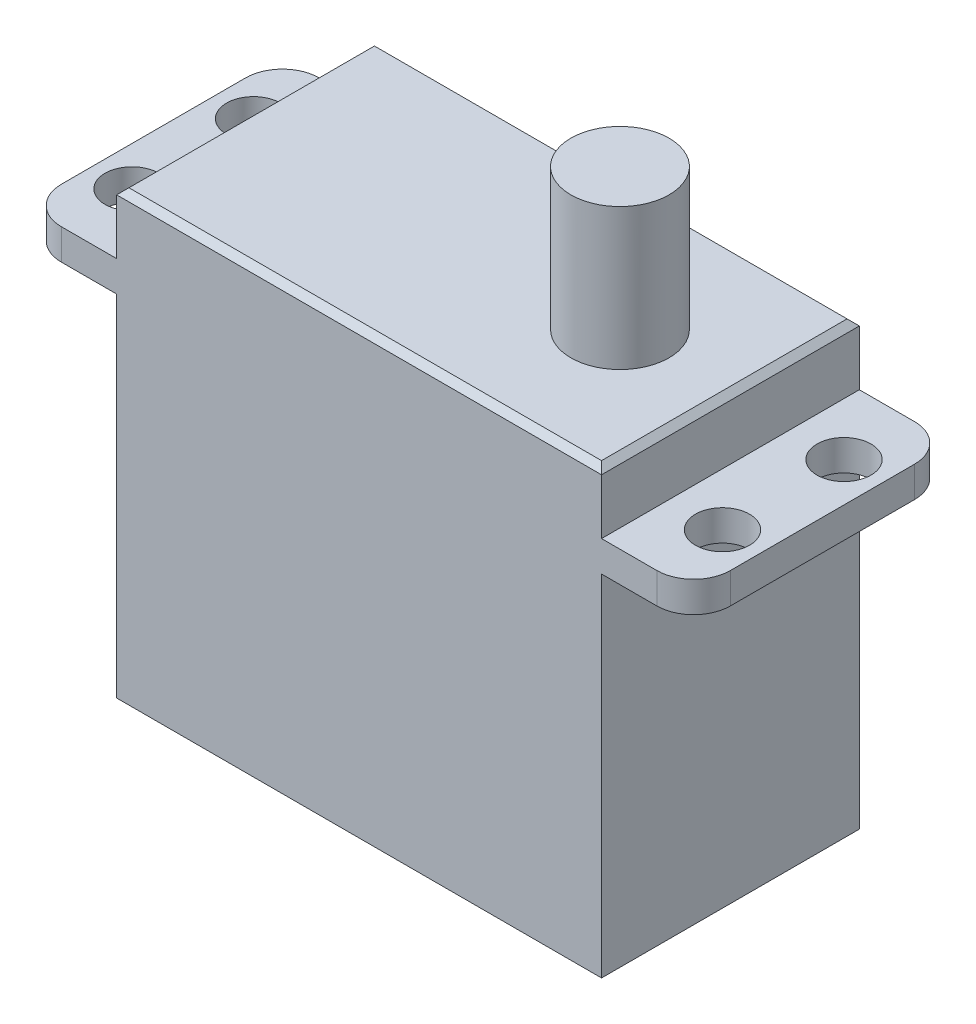
ISO-10303-21;
HEADER;
FILE_DESCRIPTION(('STEP AP214'),'2;1');
FILE_NAME('part.step','',(''),(''),'','','');
FILE_SCHEMA(('AUTOMOTIVE_DESIGN { 1 0 10303 214 1 1 1 1 }'));
ENDSEC;
DATA;
#1=APPLICATION_CONTEXT('core data for automotive mechanical design processes');
#2=APPLICATION_PROTOCOL_DEFINITION('international standard','automotive_design',2000,#1);
#3=PRODUCT_CONTEXT('',#1,'mechanical');
#4=PRODUCT('Part','Part','',(#3));
#5=PRODUCT_RELATED_PRODUCT_CATEGORY('part','',(#4));
#6=PRODUCT_DEFINITION_FORMATION('','',#4);
#7=PRODUCT_DEFINITION_CONTEXT('part definition',#1,'design');
#8=PRODUCT_DEFINITION('design','',#6,#7);
#9=PRODUCT_DEFINITION_SHAPE('','',#8);
#10=(LENGTH_UNIT() NAMED_UNIT(*) SI_UNIT(.MILLI.,.METRE.));
#11=(NAMED_UNIT(*) PLANE_ANGLE_UNIT() SI_UNIT($,.RADIAN.));
#12=(NAMED_UNIT(*) SI_UNIT($,.STERADIAN.) SOLID_ANGLE_UNIT());
#13=UNCERTAINTY_MEASURE_WITH_UNIT(LENGTH_MEASURE(1.E-05),#10,'distance_accuracy_value','');
#14=(GEOMETRIC_REPRESENTATION_CONTEXT(3) GLOBAL_UNCERTAINTY_ASSIGNED_CONTEXT((#13)) GLOBAL_UNIT_ASSIGNED_CONTEXT((#10,
#11,#12)) REPRESENTATION_CONTEXT('',''));
#15=CARTESIAN_POINT('',(0.,0.,0.));
#16=DIRECTION('',(0.,0.,1.));
#17=DIRECTION('',(1.,0.,0.));
#18=AXIS2_PLACEMENT_3D('',#15,#16,#17);
#19=CARTESIAN_POINT('',(-19.75,36.,10.5));
#20=DIRECTION('',(1.,0.,0.));
#21=DIRECTION('',(0.,0.,-1.));
#22=AXIS2_PLACEMENT_3D('',#19,#20,#21);
#23=PLANE('',#22);
#24=DIRECTION('',(0.,-1.,0.));
#25=VECTOR('',#24,1.);
#26=CARTESIAN_POINT('',(-19.75,36.,10.5));
#27=LINE('',#26,#25);
#28=CARTESIAN_POINT('',(-19.75,35.5,10.5));
#29=VERTEX_POINT('',#28);
#30=CARTESIAN_POINT('',(-19.75,31.,10.5));
#31=VERTEX_POINT('',#30);
#32=EDGE_CURVE('E257',#29,#31,#27,.T.);
#33=ORIENTED_EDGE('',*,*,#32,.F.);
#34=DIRECTION('',(0.,0.,-1.));
#35=VECTOR('',#34,1.);
#36=CARTESIAN_POINT('',(-19.75,35.5,10.5));
#37=LINE('',#36,#35);
#38=CARTESIAN_POINT('',(-19.75,35.5,-10.5));
#39=VERTEX_POINT('',#38);
#40=EDGE_CURVE('E173',#29,#39,#37,.T.);
#41=ORIENTED_EDGE('',*,*,#40,.T.);
#42=DIRECTION('',(0.,-1.,0.));
#43=VECTOR('',#42,1.);
#44=CARTESIAN_POINT('',(-19.75,36.,-10.5));
#45=LINE('',#44,#43);
#46=CARTESIAN_POINT('',(-19.75,31.,-10.5));
#47=VERTEX_POINT('',#46);
#48=EDGE_CURVE('E167',#39,#47,#45,.T.);
#49=ORIENTED_EDGE('',*,*,#48,.T.);
#50=DIRECTION('',(0.,0.,1.));
#51=VECTOR('',#50,1.);
#52=CARTESIAN_POINT('',(-19.75,31.,10.5));
#53=LINE('',#52,#51);
#54=EDGE_CURVE('E171',#47,#31,#53,.T.);
#55=ORIENTED_EDGE('',*,*,#54,.T.);
#56=EDGE_LOOP('',(#33,#41,#49,#55));
#57=FACE_BOUND('',#56,.T.);
#58=ADVANCED_FACE('F41',(#57),#23,.F.);
#59=CARTESIAN_POINT('',(19.75,36.,10.5));
#60=DIRECTION('',(-1.,0.,0.));
#61=DIRECTION('',(0.,0.,1.));
#62=AXIS2_PLACEMENT_3D('',#59,#60,#61);
#63=PLANE('',#62);
#64=DIRECTION('',(0.,-1.,0.));
#65=VECTOR('',#64,1.);
#66=CARTESIAN_POINT('',(19.75,36.,-10.5));
#67=LINE('',#66,#65);
#68=CARTESIAN_POINT('',(19.75,35.5,-10.5));
#69=VERTEX_POINT('',#68);
#70=CARTESIAN_POINT('',(19.75,31.,-10.5));
#71=VERTEX_POINT('',#70);
#72=EDGE_CURVE('E259',#69,#71,#67,.T.);
#73=ORIENTED_EDGE('',*,*,#72,.F.);
#74=DIRECTION('',(0.,0.,1.));
#75=VECTOR('',#74,1.);
#76=CARTESIAN_POINT('',(19.75,35.5,10.5));
#77=LINE('',#76,#75);
#78=CARTESIAN_POINT('',(19.75,35.5,10.5));
#79=VERTEX_POINT('',#78);
#80=EDGE_CURVE('E51',#69,#79,#77,.T.);
#81=ORIENTED_EDGE('',*,*,#80,.T.);
#82=DIRECTION('',(0.,-1.,0.));
#83=VECTOR('',#82,1.);
#84=CARTESIAN_POINT('',(19.75,36.,10.5));
#85=LINE('',#84,#83);
#86=CARTESIAN_POINT('',(19.75,31.,10.5));
#87=VERTEX_POINT('',#86);
#88=EDGE_CURVE('E254',#79,#87,#85,.T.);
#89=ORIENTED_EDGE('',*,*,#88,.T.);
#90=DIRECTION('',(0.,0.,1.));
#91=VECTOR('',#90,1.);
#92=CARTESIAN_POINT('',(19.75,31.,10.5));
#93=LINE('',#92,#91);
#94=EDGE_CURVE('E223',#71,#87,#93,.T.);
#95=ORIENTED_EDGE('',*,*,#94,.F.);
#96=EDGE_LOOP('',(#73,#81,#89,#95));
#97=FACE_BOUND('',#96,.T.);
#98=ADVANCED_FACE('F378',(#97),#63,.F.);
#99=DIRECTION('',(0.,0.,-1.));
#100=VECTOR('',#99,1.);
#101=CARTESIAN_POINT('',(19.75,28.5,10.5));
#102=LINE('',#101,#100);
#103=CARTESIAN_POINT('',(19.75,28.5,10.5));
#104=VERTEX_POINT('',#103);
#105=CARTESIAN_POINT('',(19.75,28.5,-10.5));
#106=VERTEX_POINT('',#105);
#107=EDGE_CURVE('E219',#104,#106,#102,.T.);
#108=ORIENTED_EDGE('',*,*,#107,.F.);
#109=CARTESIAN_POINT('',(19.75,0.,10.5));
#110=VERTEX_POINT('',#109);
#111=EDGE_CURVE('E253',#104,#110,#85,.T.);
#112=ORIENTED_EDGE('',*,*,#111,.T.);
#113=DIRECTION('',(0.,0.,-1.));
#114=VECTOR('',#113,1.);
#115=CARTESIAN_POINT('',(19.75,0.,10.5));
#116=LINE('',#115,#114);
#117=CARTESIAN_POINT('',(19.75,0.,-10.5));
#118=VERTEX_POINT('',#117);
#119=EDGE_CURVE('E241',#110,#118,#116,.T.);
#120=ORIENTED_EDGE('',*,*,#119,.T.);
#121=EDGE_CURVE('E174',#106,#118,#67,.T.);
#122=ORIENTED_EDGE('',*,*,#121,.F.);
#123=EDGE_LOOP('',(#108,#112,#120,#122));
#124=FACE_BOUND('',#123,.T.);
#125=ADVANCED_FACE('F385',(#124),#63,.F.);
#126=CARTESIAN_POINT('',(-19.75,36.,-10.5));
#127=DIRECTION('',(0.,0.,1.));
#128=DIRECTION('',(1.,0.,0.));
#129=AXIS2_PLACEMENT_3D('',#126,#127,#128);
#130=PLANE('',#129);
#131=ORIENTED_EDGE('',*,*,#48,.F.);
#132=DIRECTION('',(1.,0.,0.));
#133=VECTOR('',#132,1.);
#134=CARTESIAN_POINT('',(-19.75,35.5,-10.5));
#135=LINE('',#134,#133);
#136=EDGE_CURVE('E11',#39,#69,#135,.T.);
#137=ORIENTED_EDGE('',*,*,#136,.T.);
#138=ORIENTED_EDGE('',*,*,#72,.T.);
#139=DIRECTION('',(-1.,0.,0.));
#140=VECTOR('',#139,1.);
#141=CARTESIAN_POINT('',(27.25,31.,-10.5));
#142=LINE('',#141,#140);
#143=CARTESIAN_POINT('',(24.25,31.,-10.5));
#144=VERTEX_POINT('',#143);
#145=EDGE_CURVE('E222',#144,#71,#142,.T.);
#146=ORIENTED_EDGE('',*,*,#145,.F.);
#147=DIRECTION('',(0.,1.,0.));
#148=VECTOR('',#147,1.);
#149=CARTESIAN_POINT('',(24.25,36.,-10.5));
#150=LINE('',#149,#148);
#151=CARTESIAN_POINT('',(24.25,28.5,-10.5));
#152=VERTEX_POINT('',#151);
#153=EDGE_CURVE('E278',#144,#152,#150,.F.);
#154=ORIENTED_EDGE('',*,*,#153,.T.);
#155=DIRECTION('',(-1.,0.,0.));
#156=VECTOR('',#155,1.);
#157=CARTESIAN_POINT('',(27.25,28.5,-10.5));
#158=LINE('',#157,#156);
#159=EDGE_CURVE('E231',#152,#106,#158,.T.);
#160=ORIENTED_EDGE('',*,*,#159,.T.);
#161=ORIENTED_EDGE('',*,*,#121,.T.);
#162=DIRECTION('',(-1.,0.,0.));
#163=VECTOR('',#162,1.);
#164=CARTESIAN_POINT('',(-19.75,0.,-10.5));
#165=LINE('',#164,#163);
#166=CARTESIAN_POINT('',(-19.75,0.,-10.5));
#167=VERTEX_POINT('',#166);
#168=EDGE_CURVE('E244',#118,#167,#165,.T.);
#169=ORIENTED_EDGE('',*,*,#168,.T.);
#170=CARTESIAN_POINT('',(-19.75,28.5,-10.5));
#171=VERTEX_POINT('',#170);
#172=EDGE_CURVE('E175',#171,#167,#45,.T.);
#173=ORIENTED_EDGE('',*,*,#172,.F.);
#174=DIRECTION('',(1.,0.,0.));
#175=VECTOR('',#174,1.);
#176=CARTESIAN_POINT('',(-27.25,28.5,-10.5));
#177=LINE('',#176,#175);
#178=CARTESIAN_POINT('',(-24.25,28.5,-10.5));
#179=VERTEX_POINT('',#178);
#180=EDGE_CURVE('E186',#179,#171,#177,.T.);
#181=ORIENTED_EDGE('',*,*,#180,.F.);
#182=DIRECTION('',(0.,1.,0.));
#183=VECTOR('',#182,1.);
#184=CARTESIAN_POINT('',(-24.25,36.,-10.5));
#185=LINE('',#184,#183);
#186=CARTESIAN_POINT('',(-24.25,31.,-10.5));
#187=VERTEX_POINT('',#186);
#188=EDGE_CURVE('E183',#179,#187,#185,.T.);
#189=ORIENTED_EDGE('',*,*,#188,.T.);
#190=DIRECTION('',(1.,0.,0.));
#191=VECTOR('',#190,1.);
#192=CARTESIAN_POINT('',(-27.25,31.,-10.5));
#193=LINE('',#192,#191);
#194=EDGE_CURVE('E179',#187,#47,#193,.T.);
#195=ORIENTED_EDGE('',*,*,#194,.T.);
#196=EDGE_LOOP('',(#131,#137,#138,#146,#154,#160,#161,#169,#173,#181,#189,#195));
#197=FACE_BOUND('',#196,.T.);
#198=ADVANCED_FACE('F180',(#197),#130,.F.);
#199=CARTESIAN_POINT('',(-19.75,28.5,10.5));
#200=VERTEX_POINT('',#199);
#201=CARTESIAN_POINT('',(-19.75,0.,10.5));
#202=VERTEX_POINT('',#201);
#203=EDGE_CURVE('E256',#200,#202,#27,.T.);
#204=ORIENTED_EDGE('',*,*,#203,.F.);
#205=DIRECTION('',(0.,0.,-1.));
#206=VECTOR('',#205,1.);
#207=CARTESIAN_POINT('',(-19.75,28.5,10.5));
#208=LINE('',#207,#206);
#209=EDGE_CURVE('E192',#200,#171,#208,.T.);
#210=ORIENTED_EDGE('',*,*,#209,.T.);
#211=ORIENTED_EDGE('',*,*,#172,.T.);
#212=DIRECTION('',(0.,0.,1.));
#213=VECTOR('',#212,1.);
#214=CARTESIAN_POINT('',(-19.75,0.,10.5));
#215=LINE('',#214,#213);
#216=EDGE_CURVE('E247',#167,#202,#215,.T.);
#217=ORIENTED_EDGE('',*,*,#216,.T.);
#218=EDGE_LOOP('',(#204,#210,#211,#217));
#219=FACE_BOUND('',#218,.T.);
#220=ADVANCED_FACE('F380',(#219),#23,.F.);
#221=CARTESIAN_POINT('',(-19.75,36.,10.5));
#222=DIRECTION('',(0.,0.,-1.));
#223=DIRECTION('',(-1.,0.,0.));
#224=AXIS2_PLACEMENT_3D('',#221,#222,#223);
#225=PLANE('',#224);
#226=ORIENTED_EDGE('',*,*,#88,.F.);
#227=DIRECTION('',(-1.,0.,0.));
#228=VECTOR('',#227,1.);
#229=CARTESIAN_POINT('',(-19.75,35.5,10.5));
#230=LINE('',#229,#228);
#231=EDGE_CURVE('E315',#79,#29,#230,.T.);
#232=ORIENTED_EDGE('',*,*,#231,.T.);
#233=ORIENTED_EDGE('',*,*,#32,.T.);
#234=DIRECTION('',(1.,0.,0.));
#235=VECTOR('',#234,1.);
#236=CARTESIAN_POINT('',(-27.25,31.,10.5));
#237=LINE('',#236,#235);
#238=CARTESIAN_POINT('',(-24.25,31.,10.5));
#239=VERTEX_POINT('',#238);
#240=EDGE_CURVE('E191',#239,#31,#237,.T.);
#241=ORIENTED_EDGE('',*,*,#240,.F.);
#242=DIRECTION('',(0.,-1.,0.));
#243=VECTOR('',#242,1.);
#244=CARTESIAN_POINT('',(-24.25,36.,10.5));
#245=LINE('',#244,#243);
#246=CARTESIAN_POINT('',(-24.25,28.5,10.5));
#247=VERTEX_POINT('',#246);
#248=EDGE_CURVE('E302',#239,#247,#245,.T.);
#249=ORIENTED_EDGE('',*,*,#248,.T.);
#250=DIRECTION('',(1.,0.,0.));
#251=VECTOR('',#250,1.);
#252=CARTESIAN_POINT('',(-27.25,28.5,10.5));
#253=LINE('',#252,#251);
#254=EDGE_CURVE('E206',#247,#200,#253,.T.);
#255=ORIENTED_EDGE('',*,*,#254,.T.);
#256=ORIENTED_EDGE('',*,*,#203,.T.);
#257=DIRECTION('',(1.,0.,0.));
#258=VECTOR('',#257,1.);
#259=CARTESIAN_POINT('',(-19.75,0.,10.5));
#260=LINE('',#259,#258);
#261=EDGE_CURVE('E250',#202,#110,#260,.T.);
#262=ORIENTED_EDGE('',*,*,#261,.T.);
#263=ORIENTED_EDGE('',*,*,#111,.F.);
#264=DIRECTION('',(-1.,0.,0.));
#265=VECTOR('',#264,1.);
#266=CARTESIAN_POINT('',(27.25,28.5,10.5));
#267=LINE('',#266,#265);
#268=CARTESIAN_POINT('',(24.25,28.5,10.5));
#269=VERTEX_POINT('',#268);
#270=EDGE_CURVE('E233',#269,#104,#267,.T.);
#271=ORIENTED_EDGE('',*,*,#270,.F.);
#272=DIRECTION('',(0.,-1.,0.));
#273=VECTOR('',#272,1.);
#274=CARTESIAN_POINT('',(24.25,36.,10.5));
#275=LINE('',#274,#273);
#276=CARTESIAN_POINT('',(24.25,31.,10.5));
#277=VERTEX_POINT('',#276);
#278=EDGE_CURVE('E284',#269,#277,#275,.F.);
#279=ORIENTED_EDGE('',*,*,#278,.T.);
#280=DIRECTION('',(-1.,0.,0.));
#281=VECTOR('',#280,1.);
#282=CARTESIAN_POINT('',(27.25,31.,10.5));
#283=LINE('',#282,#281);
#284=EDGE_CURVE('E235',#277,#87,#283,.T.);
#285=ORIENTED_EDGE('',*,*,#284,.T.);
#286=EDGE_LOOP('',(#226,#232,#233,#241,#249,#255,#256,#262,#263,#271,#279,#285));
#287=FACE_BOUND('',#286,.T.);
#288=ADVANCED_FACE('F357',(#287),#225,.F.);
#289=CARTESIAN_POINT('',(0.,36.,0.));
#290=DIRECTION('',(0.,-1.,0.));
#291=DIRECTION('',(0.,0.,-1.));
#292=AXIS2_PLACEMENT_3D('',#289,#290,#291);
#293=PLANE('',#292);
#294=DIRECTION('',(-1.,0.,0.));
#295=VECTOR('',#294,1.);
#296=CARTESIAN_POINT('',(0.,36.,-10.));
#297=LINE('',#296,#295);
#298=CARTESIAN_POINT('',(19.25,36.,-10.));
#299=VERTEX_POINT('',#298);
#300=CARTESIAN_POINT('',(-19.25,36.,-10.));
#301=VERTEX_POINT('',#300);
#302=EDGE_CURVE('E305',#299,#301,#297,.T.);
#303=ORIENTED_EDGE('',*,*,#302,.T.);
#304=DIRECTION('',(0.,0.,1.));
#305=VECTOR('',#304,1.);
#306=CARTESIAN_POINT('',(-19.25,36.,0.));
#307=LINE('',#306,#305);
#308=CARTESIAN_POINT('',(-19.25,36.,10.));
#309=VERTEX_POINT('',#308);
#310=EDGE_CURVE('E311',#301,#309,#307,.T.);
#311=ORIENTED_EDGE('',*,*,#310,.T.);
#312=DIRECTION('',(1.,0.,0.));
#313=VECTOR('',#312,1.);
#314=CARTESIAN_POINT('',(0.,36.,10.));
#315=LINE('',#314,#313);
#316=CARTESIAN_POINT('',(19.25,36.,10.));
#317=VERTEX_POINT('',#316);
#318=EDGE_CURVE('E309',#309,#317,#315,.T.);
#319=ORIENTED_EDGE('',*,*,#318,.T.);
#320=DIRECTION('',(0.,0.,-1.));
#321=VECTOR('',#320,1.);
#322=CARTESIAN_POINT('',(19.25,36.,0.));
#323=LINE('',#322,#321);
#324=EDGE_CURVE('E307',#317,#299,#323,.T.);
#325=ORIENTED_EDGE('',*,*,#324,.T.);
#326=EDGE_LOOP('',(#303,#311,#319,#325));
#327=FACE_BOUND('',#326,.T.);
#328=CARTESIAN_POINT('',(10.75,36.,0.));
#329=DIRECTION('',(0.,-1.,0.));
#330=DIRECTION('',(0.,0.,-1.));
#331=AXIS2_PLACEMENT_3D('',#328,#329,#330);
#332=CIRCLE('',#331,4.);
#333=CARTESIAN_POINT('',(10.75,36.,-4.));
#334=VERTEX_POINT('',#333);
#335=EDGE_CURVE('E261',#334,#334,#332,.F.);
#336=ORIENTED_EDGE('',*,*,#335,.F.);
#337=EDGE_LOOP('',(#336));
#338=FACE_BOUND('',#337,.T.);
#339=ADVANCED_FACE('F366',(#327,#338),#293,.F.);
#340=CARTESIAN_POINT('',(0.,0.,0.));
#341=DIRECTION('',(0.,-1.,0.));
#342=DIRECTION('',(0.,0.,-1.));
#343=AXIS2_PLACEMENT_3D('',#340,#341,#342);
#344=PLANE('',#343);
#345=ORIENTED_EDGE('',*,*,#119,.F.);
#346=ORIENTED_EDGE('',*,*,#261,.F.);
#347=ORIENTED_EDGE('',*,*,#216,.F.);
#348=ORIENTED_EDGE('',*,*,#168,.F.);
#349=EDGE_LOOP('',(#345,#346,#347,#348));
#350=FACE_BOUND('',#349,.T.);
#351=ADVANCED_FACE('F407',(#350),#344,.T.);
#352=CARTESIAN_POINT('',(10.75,47.5,0.));
#353=DIRECTION('',(0.,-1.,0.));
#354=DIRECTION('',(0.,0.,-1.));
#355=AXIS2_PLACEMENT_3D('',#352,#353,#354);
#356=CYLINDRICAL_SURFACE('',#355,4.);
#357=CARTESIAN_POINT('',(10.75,47.5,0.));
#358=DIRECTION('',(0.,1.,0.));
#359=DIRECTION('',(0.,0.,1.));
#360=AXIS2_PLACEMENT_3D('',#357,#358,#359);
#361=CIRCLE('',#360,4.);
#362=CARTESIAN_POINT('',(10.75,47.5,4.));
#363=VERTEX_POINT('',#362);
#364=EDGE_CURVE('E238',#363,#363,#361,.T.);
#365=ORIENTED_EDGE('',*,*,#364,.F.);
#366=EDGE_LOOP('',(#365));
#367=FACE_BOUND('',#366,.T.);
#368=ORIENTED_EDGE('',*,*,#335,.T.);
#369=EDGE_LOOP('',(#368));
#370=FACE_BOUND('',#369,.T.);
#371=ADVANCED_FACE('F450',(#367,#370),#356,.T.);
#372=CARTESIAN_POINT('',(10.75,47.5,0.));
#373=DIRECTION('',(0.,1.,0.));
#374=DIRECTION('',(0.,0.,1.));
#375=AXIS2_PLACEMENT_3D('',#372,#373,#374);
#376=PLANE('',#375);
#377=ORIENTED_EDGE('',*,*,#364,.T.);
#378=EDGE_LOOP('',(#377));
#379=FACE_BOUND('',#378,.T.);
#380=ADVANCED_FACE('F442',(#379),#376,.T.);
#381=CARTESIAN_POINT('',(27.25,31.,10.5));
#382=DIRECTION('',(0.,-1.,0.));
#383=DIRECTION('',(0.,0.,-1.));
#384=AXIS2_PLACEMENT_3D('',#381,#382,#383);
#385=PLANE('',#384);
#386=CARTESIAN_POINT('',(24.05,31.,-4.94999999999999));
#387=DIRECTION('',(0.,1.,0.));
#388=DIRECTION('',(0.,0.,1.));
#389=AXIS2_PLACEMENT_3D('',#386,#387,#388);
#390=CIRCLE('',#389,2.20000000000001);
#391=CARTESIAN_POINT('',(24.05,31.,-2.74999999999998));
#392=VERTEX_POINT('',#391);
#393=EDGE_CURVE('E209',#392,#392,#390,.T.);
#394=ORIENTED_EDGE('',*,*,#393,.F.);
#395=EDGE_LOOP('',(#394));
#396=FACE_BOUND('',#395,.T.);
#397=CARTESIAN_POINT('',(24.05,31.,4.95000000000001));
#398=DIRECTION('',(0.,1.,0.));
#399=DIRECTION('',(0.,0.,1.));
#400=AXIS2_PLACEMENT_3D('',#397,#398,#399);
#401=CIRCLE('',#400,2.20000000000003);
#402=CARTESIAN_POINT('',(24.05,31.,7.15000000000004));
#403=VERTEX_POINT('',#402);
#404=EDGE_CURVE('E185',#403,#403,#401,.T.);
#405=ORIENTED_EDGE('',*,*,#404,.F.);
#406=EDGE_LOOP('',(#405));
#407=FACE_BOUND('',#406,.T.);
#408=DIRECTION('',(0.,0.,1.));
#409=VECTOR('',#408,1.);
#410=CARTESIAN_POINT('',(27.25,31.,10.5));
#411=LINE('',#410,#409);
#412=CARTESIAN_POINT('',(27.25,31.,-7.5));
#413=VERTEX_POINT('',#412);
#414=CARTESIAN_POINT('',(27.25,31.,7.5));
#415=VERTEX_POINT('',#414);
#416=EDGE_CURVE('E215',#413,#415,#411,.T.);
#417=ORIENTED_EDGE('',*,*,#416,.F.);
#418=CARTESIAN_POINT('',(24.25,31.,-7.5));
#419=DIRECTION('',(0.,-1.,0.));
#420=DIRECTION('',(0.,0.,-1.));
#421=AXIS2_PLACEMENT_3D('',#418,#419,#420);
#422=CIRCLE('',#421,3.);
#423=EDGE_CURVE('E276',#413,#144,#422,.F.);
#424=ORIENTED_EDGE('',*,*,#423,.T.);
#425=ORIENTED_EDGE('',*,*,#145,.T.);
#426=ORIENTED_EDGE('',*,*,#94,.T.);
#427=ORIENTED_EDGE('',*,*,#284,.F.);
#428=CARTESIAN_POINT('',(24.25,31.,7.5));
#429=DIRECTION('',(0.,-1.,0.));
#430=DIRECTION('',(0.,0.,-1.));
#431=AXIS2_PLACEMENT_3D('',#428,#429,#430);
#432=CIRCLE('',#431,3.);
#433=EDGE_CURVE('E274',#277,#415,#432,.F.);
#434=ORIENTED_EDGE('',*,*,#433,.T.);
#435=EDGE_LOOP('',(#417,#424,#425,#426,#427,#434));
#436=FACE_BOUND('',#435,.T.);
#437=ADVANCED_FACE('F420',(#396,#407,#436),#385,.F.);
#438=CARTESIAN_POINT('',(27.25,28.5,10.5));
#439=DIRECTION('',(0.,1.,0.));
#440=DIRECTION('',(0.,0.,1.));
#441=AXIS2_PLACEMENT_3D('',#438,#439,#440);
#442=PLANE('',#441);
#443=CARTESIAN_POINT('',(24.05,28.5,-4.94999999999999));
#444=DIRECTION('',(0.,1.,0.));
#445=DIRECTION('',(0.,0.,1.));
#446=AXIS2_PLACEMENT_3D('',#443,#444,#445);
#447=CIRCLE('',#446,2.20000000000001);
#448=CARTESIAN_POINT('',(24.05,28.5,-2.74999999999998));
#449=VERTEX_POINT('',#448);
#450=EDGE_CURVE('E226',#449,#449,#447,.T.);
#451=ORIENTED_EDGE('',*,*,#450,.T.);
#452=EDGE_LOOP('',(#451));
#453=FACE_BOUND('',#452,.T.);
#454=CARTESIAN_POINT('',(24.05,28.5,4.95000000000001));
#455=DIRECTION('',(0.,1.,0.));
#456=DIRECTION('',(0.,0.,1.));
#457=AXIS2_PLACEMENT_3D('',#454,#455,#456);
#458=CIRCLE('',#457,2.20000000000003);
#459=CARTESIAN_POINT('',(24.05,28.5,7.15000000000004));
#460=VERTEX_POINT('',#459);
#461=EDGE_CURVE('E212',#460,#460,#458,.T.);
#462=ORIENTED_EDGE('',*,*,#461,.T.);
#463=EDGE_LOOP('',(#462));
#464=FACE_BOUND('',#463,.T.);
#465=ORIENTED_EDGE('',*,*,#159,.F.);
#466=CARTESIAN_POINT('',(24.25,28.5,-7.5));
#467=DIRECTION('',(0.,1.,0.));
#468=DIRECTION('',(0.,0.,1.));
#469=AXIS2_PLACEMENT_3D('',#466,#467,#468);
#470=CIRCLE('',#469,3.);
#471=CARTESIAN_POINT('',(27.25,28.5,-7.5));
#472=VERTEX_POINT('',#471);
#473=EDGE_CURVE('E282',#152,#472,#470,.F.);
#474=ORIENTED_EDGE('',*,*,#473,.T.);
#475=DIRECTION('',(0.,0.,-1.));
#476=VECTOR('',#475,1.);
#477=CARTESIAN_POINT('',(27.25,28.5,10.5));
#478=LINE('',#477,#476);
#479=CARTESIAN_POINT('',(27.25,28.5,7.5));
#480=VERTEX_POINT('',#479);
#481=EDGE_CURVE('E218',#480,#472,#478,.T.);
#482=ORIENTED_EDGE('',*,*,#481,.F.);
#483=CARTESIAN_POINT('',(24.25,28.5,7.5));
#484=DIRECTION('',(0.,1.,0.));
#485=DIRECTION('',(0.,0.,1.));
#486=AXIS2_PLACEMENT_3D('',#483,#484,#485);
#487=CIRCLE('',#486,3.);
#488=EDGE_CURVE('E280',#480,#269,#487,.F.);
#489=ORIENTED_EDGE('',*,*,#488,.T.);
#490=ORIENTED_EDGE('',*,*,#270,.T.);
#491=ORIENTED_EDGE('',*,*,#107,.T.);
#492=EDGE_LOOP('',(#465,#474,#482,#489,#490,#491));
#493=FACE_BOUND('',#492,.T.);
#494=ADVANCED_FACE('F432',(#453,#464,#493),#442,.F.);
#495=CARTESIAN_POINT('',(27.25,0.,0.));
#496=DIRECTION('',(-1.,0.,0.));
#497=DIRECTION('',(0.,0.,1.));
#498=AXIS2_PLACEMENT_3D('',#495,#496,#497);
#499=PLANE('',#498);
#500=ORIENTED_EDGE('',*,*,#481,.T.);
#501=DIRECTION('',(0.,1.,0.));
#502=VECTOR('',#501,1.);
#503=CARTESIAN_POINT('',(27.25,0.,-7.5));
#504=LINE('',#503,#502);
#505=EDGE_CURVE('E271',#472,#413,#504,.T.);
#506=ORIENTED_EDGE('',*,*,#505,.T.);
#507=ORIENTED_EDGE('',*,*,#416,.T.);
#508=DIRECTION('',(0.,-1.,0.));
#509=VECTOR('',#508,1.);
#510=CARTESIAN_POINT('',(27.25,0.,7.5));
#511=LINE('',#510,#509);
#512=EDGE_CURVE('E264',#415,#480,#511,.T.);
#513=ORIENTED_EDGE('',*,*,#512,.T.);
#514=EDGE_LOOP('',(#500,#506,#507,#513));
#515=FACE_BOUND('',#514,.T.);
#516=ADVANCED_FACE('F422',(#515),#499,.F.);
#517=CARTESIAN_POINT('',(24.05,23.5,4.95000000000001));
#518=DIRECTION('',(0.,1.,0.));
#519=DIRECTION('',(0.,0.,1.));
#520=AXIS2_PLACEMENT_3D('',#517,#518,#519);
#521=CYLINDRICAL_SURFACE('',#520,2.20000000000003);
#522=ORIENTED_EDGE('',*,*,#404,.T.);
#523=EDGE_LOOP('',(#522));
#524=FACE_BOUND('',#523,.T.);
#525=ORIENTED_EDGE('',*,*,#461,.F.);
#526=EDGE_LOOP('',(#525));
#527=FACE_BOUND('',#526,.T.);
#528=ADVANCED_FACE('F440',(#524,#527),#521,.F.);
#529=CARTESIAN_POINT('',(24.05,23.5,-4.94999999999999));
#530=DIRECTION('',(0.,1.,0.));
#531=DIRECTION('',(0.,0.,1.));
#532=AXIS2_PLACEMENT_3D('',#529,#530,#531);
#533=CYLINDRICAL_SURFACE('',#532,2.20000000000001);
#534=ORIENTED_EDGE('',*,*,#393,.T.);
#535=EDGE_LOOP('',(#534));
#536=FACE_BOUND('',#535,.T.);
#537=ORIENTED_EDGE('',*,*,#450,.F.);
#538=EDGE_LOOP('',(#537));
#539=FACE_BOUND('',#538,.T.);
#540=ADVANCED_FACE('F484',(#536,#539),#533,.F.);
#541=CARTESIAN_POINT('',(24.25,0.,-7.5));
#542=DIRECTION('',(0.,1.,0.));
#543=DIRECTION('',(0.,0.,1.));
#544=AXIS2_PLACEMENT_3D('',#541,#542,#543);
#545=CYLINDRICAL_SURFACE('',#544,3.);
#546=ORIENTED_EDGE('',*,*,#473,.F.);
#547=ORIENTED_EDGE('',*,*,#153,.F.);
#548=ORIENTED_EDGE('',*,*,#423,.F.);
#549=ORIENTED_EDGE('',*,*,#505,.F.);
#550=EDGE_LOOP('',(#546,#547,#548,#549));
#551=FACE_BOUND('',#550,.T.);
#552=ADVANCED_FACE('F427',(#551),#545,.T.);
#553=CARTESIAN_POINT('',(24.25,0.,7.5));
#554=DIRECTION('',(0.,-1.,0.));
#555=DIRECTION('',(0.,0.,-1.));
#556=AXIS2_PLACEMENT_3D('',#553,#554,#555);
#557=CYLINDRICAL_SURFACE('',#556,3.);
#558=ORIENTED_EDGE('',*,*,#433,.F.);
#559=ORIENTED_EDGE('',*,*,#278,.F.);
#560=ORIENTED_EDGE('',*,*,#488,.F.);
#561=ORIENTED_EDGE('',*,*,#512,.F.);
#562=EDGE_LOOP('',(#558,#559,#560,#561));
#563=FACE_BOUND('',#562,.T.);
#564=ADVANCED_FACE('F416',(#563),#557,.T.);
#565=CARTESIAN_POINT('',(-27.25,31.,10.5));
#566=DIRECTION('',(0.,1.,0.));
#567=DIRECTION('',(0.,0.,1.));
#568=AXIS2_PLACEMENT_3D('',#565,#566,#567);
#569=PLANE('',#568);
#570=CARTESIAN_POINT('',(-24.05,31.,-4.94999999999999));
#571=DIRECTION('',(0.,-1.,0.));
#572=DIRECTION('',(0.,0.,1.));
#573=AXIS2_PLACEMENT_3D('',#570,#571,#572);
#574=CIRCLE('',#573,2.20000000000001);
#575=CARTESIAN_POINT('',(-24.05,31.,-2.74999999999998));
#576=VERTEX_POINT('',#575);
#577=EDGE_CURVE('E287',#576,#576,#574,.T.);
#578=ORIENTED_EDGE('',*,*,#577,.T.);
#579=EDGE_LOOP('',(#578));
#580=FACE_BOUND('',#579,.T.);
#581=CARTESIAN_POINT('',(-24.05,31.,4.95000000000001));
#582=DIRECTION('',(0.,-1.,0.));
#583=DIRECTION('',(0.,0.,1.));
#584=AXIS2_PLACEMENT_3D('',#581,#582,#583);
#585=CIRCLE('',#584,2.20000000000003);
#586=CARTESIAN_POINT('',(-24.05,31.,7.15000000000004));
#587=VERTEX_POINT('',#586);
#588=EDGE_CURVE('E328',#587,#587,#585,.T.);
#589=ORIENTED_EDGE('',*,*,#588,.T.);
#590=EDGE_LOOP('',(#589));
#591=FACE_BOUND('',#590,.T.);
#592=ORIENTED_EDGE('',*,*,#194,.F.);
#593=CARTESIAN_POINT('',(-24.25,31.,-7.5));
#594=DIRECTION('',(0.,1.,0.));
#595=DIRECTION('',(0.,0.,1.));
#596=AXIS2_PLACEMENT_3D('',#593,#594,#595);
#597=CIRCLE('',#596,3.);
#598=CARTESIAN_POINT('',(-27.25,31.,-7.5));
#599=VERTEX_POINT('',#598);
#600=EDGE_CURVE('E292',#187,#599,#597,.T.);
#601=ORIENTED_EDGE('',*,*,#600,.T.);
#602=DIRECTION('',(0.,0.,1.));
#603=VECTOR('',#602,1.);
#604=CARTESIAN_POINT('',(-27.25,31.,10.5));
#605=LINE('',#604,#603);
#606=CARTESIAN_POINT('',(-27.25,31.,7.5));
#607=VERTEX_POINT('',#606);
#608=EDGE_CURVE('E196',#599,#607,#605,.T.);
#609=ORIENTED_EDGE('',*,*,#608,.T.);
#610=CARTESIAN_POINT('',(-24.25,31.,7.5));
#611=DIRECTION('',(0.,1.,0.));
#612=DIRECTION('',(0.,0.,1.));
#613=AXIS2_PLACEMENT_3D('',#610,#611,#612);
#614=CIRCLE('',#613,3.);
#615=EDGE_CURVE('E290',#607,#239,#614,.T.);
#616=ORIENTED_EDGE('',*,*,#615,.T.);
#617=ORIENTED_EDGE('',*,*,#240,.T.);
#618=ORIENTED_EDGE('',*,*,#54,.F.);
#619=EDGE_LOOP('',(#592,#601,#609,#616,#617,#618));
#620=FACE_BOUND('',#619,.T.);
#621=ADVANCED_FACE('F189',(#580,#591,#620),#569,.T.);
#622=CARTESIAN_POINT('',(-27.25,28.5,10.5));
#623=DIRECTION('',(0.,-1.,0.));
#624=DIRECTION('',(0.,0.,-1.));
#625=AXIS2_PLACEMENT_3D('',#622,#623,#624);
#626=PLANE('',#625);
#627=CARTESIAN_POINT('',(-24.05,28.5,-4.94999999999999));
#628=DIRECTION('',(0.,-1.,0.));
#629=DIRECTION('',(0.,0.,-1.));
#630=AXIS2_PLACEMENT_3D('',#627,#628,#629);
#631=CIRCLE('',#630,2.20000000000001);
#632=CARTESIAN_POINT('',(-24.05,28.5,-7.15000000000001));
#633=VERTEX_POINT('',#632);
#634=EDGE_CURVE('E193',#633,#633,#631,.F.);
#635=ORIENTED_EDGE('',*,*,#634,.T.);
#636=EDGE_LOOP('',(#635));
#637=FACE_BOUND('',#636,.T.);
#638=CARTESIAN_POINT('',(-24.05,28.5,4.95000000000001));
#639=DIRECTION('',(0.,-1.,0.));
#640=DIRECTION('',(0.,0.,-1.));
#641=AXIS2_PLACEMENT_3D('',#638,#639,#640);
#642=CIRCLE('',#641,2.20000000000003);
#643=CARTESIAN_POINT('',(-24.05,28.5,2.74999999999997));
#644=VERTEX_POINT('',#643);
#645=EDGE_CURVE('E199',#644,#644,#642,.F.);
#646=ORIENTED_EDGE('',*,*,#645,.T.);
#647=EDGE_LOOP('',(#646));
#648=FACE_BOUND('',#647,.T.);
#649=DIRECTION('',(0.,0.,-1.));
#650=VECTOR('',#649,1.);
#651=CARTESIAN_POINT('',(-27.25,28.5,10.5));
#652=LINE('',#651,#650);
#653=CARTESIAN_POINT('',(-27.25,28.5,7.5));
#654=VERTEX_POINT('',#653);
#655=CARTESIAN_POINT('',(-27.25,28.5,-7.5));
#656=VERTEX_POINT('',#655);
#657=EDGE_CURVE('E202',#654,#656,#652,.T.);
#658=ORIENTED_EDGE('',*,*,#657,.T.);
#659=CARTESIAN_POINT('',(-24.25,28.5,-7.5));
#660=DIRECTION('',(0.,-1.,0.));
#661=DIRECTION('',(0.,0.,-1.));
#662=AXIS2_PLACEMENT_3D('',#659,#660,#661);
#663=CIRCLE('',#662,3.);
#664=EDGE_CURVE('E300',#656,#179,#663,.T.);
#665=ORIENTED_EDGE('',*,*,#664,.T.);
#666=ORIENTED_EDGE('',*,*,#180,.T.);
#667=ORIENTED_EDGE('',*,*,#209,.F.);
#668=ORIENTED_EDGE('',*,*,#254,.F.);
#669=CARTESIAN_POINT('',(-24.25,28.5,7.5));
#670=DIRECTION('',(0.,-1.,0.));
#671=DIRECTION('',(0.,0.,-1.));
#672=AXIS2_PLACEMENT_3D('',#669,#670,#671);
#673=CIRCLE('',#672,3.);
#674=EDGE_CURVE('E298',#247,#654,#673,.T.);
#675=ORIENTED_EDGE('',*,*,#674,.T.);
#676=EDGE_LOOP('',(#658,#665,#666,#667,#668,#675));
#677=FACE_BOUND('',#676,.T.);
#678=ADVANCED_FACE('F345',(#637,#648,#677),#626,.T.);
#679=CARTESIAN_POINT('',(-27.25,0.,0.));
#680=DIRECTION('',(1.,0.,0.));
#681=DIRECTION('',(0.,0.,1.));
#682=AXIS2_PLACEMENT_3D('',#679,#680,#681);
#683=PLANE('',#682);
#684=ORIENTED_EDGE('',*,*,#608,.F.);
#685=DIRECTION('',(0.,1.,0.));
#686=VECTOR('',#685,1.);
#687=CARTESIAN_POINT('',(-27.25,0.,-7.5));
#688=LINE('',#687,#686);
#689=EDGE_CURVE('E296',#599,#656,#688,.F.);
#690=ORIENTED_EDGE('',*,*,#689,.T.);
#691=ORIENTED_EDGE('',*,*,#657,.F.);
#692=DIRECTION('',(0.,-1.,0.));
#693=VECTOR('',#692,1.);
#694=CARTESIAN_POINT('',(-27.25,0.,7.5));
#695=LINE('',#694,#693);
#696=EDGE_CURVE('E294',#654,#607,#695,.F.);
#697=ORIENTED_EDGE('',*,*,#696,.T.);
#698=EDGE_LOOP('',(#684,#690,#691,#697));
#699=FACE_BOUND('',#698,.T.);
#700=ADVANCED_FACE('F352',(#699),#683,.F.);
#701=CARTESIAN_POINT('',(-24.05,23.5,4.95000000000001));
#702=DIRECTION('',(0.,1.,0.));
#703=DIRECTION('',(0.,0.,1.));
#704=AXIS2_PLACEMENT_3D('',#701,#702,#703);
#705=CYLINDRICAL_SURFACE('',#704,2.20000000000003);
#706=ORIENTED_EDGE('',*,*,#645,.F.);
#707=EDGE_LOOP('',(#706));
#708=FACE_BOUND('',#707,.T.);
#709=ORIENTED_EDGE('',*,*,#588,.F.);
#710=EDGE_LOOP('',(#709));
#711=FACE_BOUND('',#710,.T.);
#712=ADVANCED_FACE('F570',(#708,#711),#705,.F.);
#713=CARTESIAN_POINT('',(-24.05,23.5,-4.94999999999999));
#714=DIRECTION('',(0.,1.,0.));
#715=DIRECTION('',(0.,0.,1.));
#716=AXIS2_PLACEMENT_3D('',#713,#714,#715);
#717=CYLINDRICAL_SURFACE('',#716,2.20000000000001);
#718=ORIENTED_EDGE('',*,*,#634,.F.);
#719=EDGE_LOOP('',(#718));
#720=FACE_BOUND('',#719,.T.);
#721=ORIENTED_EDGE('',*,*,#577,.F.);
#722=EDGE_LOOP('',(#721));
#723=FACE_BOUND('',#722,.T.);
#724=ADVANCED_FACE('F579',(#720,#723),#717,.F.);
#725=CARTESIAN_POINT('',(-24.25,36.,-7.5));
#726=DIRECTION('',(0.,1.,0.));
#727=DIRECTION('',(0.,0.,1.));
#728=AXIS2_PLACEMENT_3D('',#725,#726,#727);
#729=CYLINDRICAL_SURFACE('',#728,3.);
#730=ORIENTED_EDGE('',*,*,#664,.F.);
#731=ORIENTED_EDGE('',*,*,#689,.F.);
#732=ORIENTED_EDGE('',*,*,#600,.F.);
#733=ORIENTED_EDGE('',*,*,#188,.F.);
#734=EDGE_LOOP('',(#730,#731,#732,#733));
#735=FACE_BOUND('',#734,.T.);
#736=ADVANCED_FACE('F351',(#735),#729,.T.);
#737=CARTESIAN_POINT('',(-24.25,36.,7.5));
#738=DIRECTION('',(0.,-1.,0.));
#739=DIRECTION('',(0.,0.,-1.));
#740=AXIS2_PLACEMENT_3D('',#737,#738,#739);
#741=CYLINDRICAL_SURFACE('',#740,3.);
#742=ORIENTED_EDGE('',*,*,#615,.F.);
#743=ORIENTED_EDGE('',*,*,#696,.F.);
#744=ORIENTED_EDGE('',*,*,#674,.F.);
#745=ORIENTED_EDGE('',*,*,#248,.F.);
#746=EDGE_LOOP('',(#742,#743,#744,#745));
#747=FACE_BOUND('',#746,.T.);
#748=ADVANCED_FACE('F354',(#747),#741,.T.);
#749=CARTESIAN_POINT('',(19.25,36.,0.));
#750=DIRECTION('',(-0.707106781186547,-0.707106781186547,0.));
#751=DIRECTION('',(0.,0.,-1.));
#752=AXIS2_PLACEMENT_3D('',#749,#750,#751);
#753=PLANE('',#752);
#754=DIRECTION('',(0.577350269189626,-0.577350269189626,0.577350269189626));
#755=VECTOR('',#754,1.);
#756=CARTESIAN_POINT('',(15.9166666666667,39.3333333333333,6.66666666666667));
#757=LINE('',#756,#755);
#758=EDGE_CURVE('E321',#79,#317,#757,.F.);
#759=ORIENTED_EDGE('',*,*,#758,.F.);
#760=ORIENTED_EDGE('',*,*,#80,.F.);
#761=DIRECTION('',(0.577350269189626,-0.577350269189626,-0.577350269189626));
#762=VECTOR('',#761,1.);
#763=CARTESIAN_POINT('',(12.8333333333333,42.4166666666667,-3.58333333333333));
#764=LINE('',#763,#762);
#765=EDGE_CURVE('E46',#299,#69,#764,.T.);
#766=ORIENTED_EDGE('',*,*,#765,.F.);
#767=ORIENTED_EDGE('',*,*,#324,.F.);
#768=EDGE_LOOP('',(#759,#760,#766,#767));
#769=FACE_BOUND('',#768,.T.);
#770=ADVANCED_FACE('F44',(#769),#753,.F.);
#771=CARTESIAN_POINT('',(0.,36.,-10.));
#772=DIRECTION('',(0.,-0.707106781186547,0.707106781186547));
#773=DIRECTION('',(-1.,0.,0.));
#774=AXIS2_PLACEMENT_3D('',#771,#772,#773);
#775=PLANE('',#774);
#776=ORIENTED_EDGE('',*,*,#765,.T.);
#777=ORIENTED_EDGE('',*,*,#136,.F.);
#778=DIRECTION('',(0.577350269189626,0.577350269189626,0.577350269189626));
#779=VECTOR('',#778,1.);
#780=CARTESIAN_POINT('',(-12.8333333333333,42.4166666666667,-3.58333333333333));
#781=LINE('',#780,#779);
#782=EDGE_CURVE('E320',#301,#39,#781,.F.);
#783=ORIENTED_EDGE('',*,*,#782,.F.);
#784=ORIENTED_EDGE('',*,*,#302,.F.);
#785=EDGE_LOOP('',(#776,#777,#783,#784));
#786=FACE_BOUND('',#785,.T.);
#787=ADVANCED_FACE('F368',(#786),#775,.F.);
#788=CARTESIAN_POINT('',(0.,36.,10.));
#789=DIRECTION('',(0.,-0.707106781186547,-0.707106781186547));
#790=DIRECTION('',(1.,0.,0.));
#791=AXIS2_PLACEMENT_3D('',#788,#789,#790);
#792=PLANE('',#791);
#793=ORIENTED_EDGE('',*,*,#758,.T.);
#794=ORIENTED_EDGE('',*,*,#318,.F.);
#795=DIRECTION('',(-0.577350269189626,-0.577350269189626,0.577350269189626));
#796=VECTOR('',#795,1.);
#797=CARTESIAN_POINT('',(-12.8333333333333,42.4166666666667,3.58333333333333));
#798=LINE('',#797,#796);
#799=EDGE_CURVE('E318',#29,#309,#798,.F.);
#800=ORIENTED_EDGE('',*,*,#799,.F.);
#801=ORIENTED_EDGE('',*,*,#231,.F.);
#802=EDGE_LOOP('',(#793,#794,#800,#801));
#803=FACE_BOUND('',#802,.T.);
#804=ADVANCED_FACE('F363',(#803),#792,.F.);
#805=CARTESIAN_POINT('',(-19.25,36.,0.));
#806=DIRECTION('',(0.707106781186547,-0.707106781186547,0.));
#807=DIRECTION('',(0.,0.,1.));
#808=AXIS2_PLACEMENT_3D('',#805,#806,#807);
#809=PLANE('',#808);
#810=ORIENTED_EDGE('',*,*,#782,.T.);
#811=ORIENTED_EDGE('',*,*,#40,.F.);
#812=ORIENTED_EDGE('',*,*,#799,.T.);
#813=ORIENTED_EDGE('',*,*,#310,.F.);
#814=EDGE_LOOP('',(#810,#811,#812,#813));
#815=FACE_BOUND('',#814,.T.);
#816=ADVANCED_FACE('F360',(#815),#809,.F.);
#817=CLOSED_SHELL('',(#58,#98,#125,#198,#220,#288,#339,#351,#371,#380,#437,#494,#516,#528,#540,
#552,#564,#621,#678,#700,#712,#724,#736,#748,#770,#787,#804,#816));
#818=MANIFOLD_SOLID_BREP('B2',#817);
#819=ADVANCED_BREP_SHAPE_REPRESENTATION('',(#18,#818),#14);
#820=SHAPE_DEFINITION_REPRESENTATION(#9,#819);
ENDSEC;
END-ISO-10303-21;
